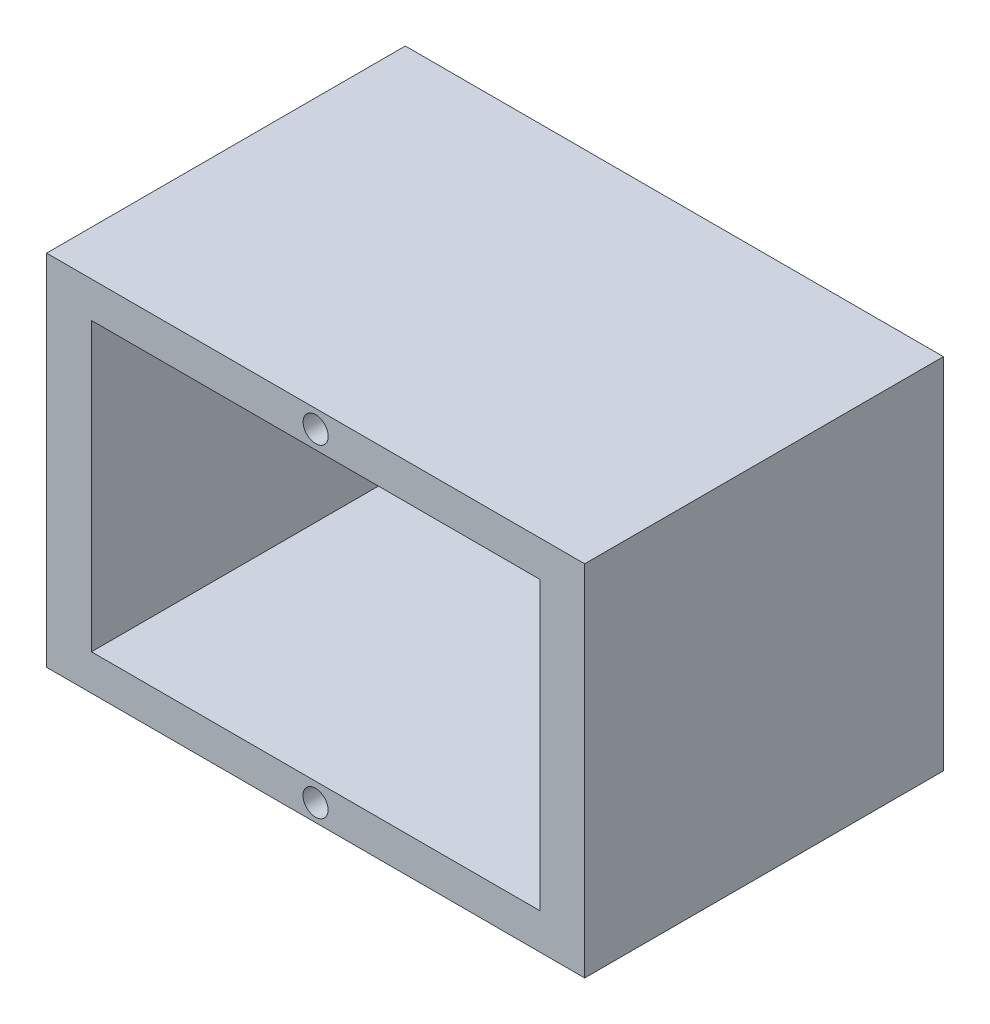
ISO-10303-21;
HEADER;
FILE_DESCRIPTION(('STEP AP214'),'2;1');
FILE_NAME('part.step','',(''),(''),'','','');
FILE_SCHEMA(('AUTOMOTIVE_DESIGN { 1 0 10303 214 1 1 1 1 }'));
ENDSEC;
DATA;
#1=APPLICATION_CONTEXT('core data for automotive mechanical design processes');
#2=APPLICATION_PROTOCOL_DEFINITION('international standard','automotive_design',2000,#1);
#3=PRODUCT_CONTEXT('',#1,'mechanical');
#4=PRODUCT('Part','Part','',(#3));
#5=PRODUCT_RELATED_PRODUCT_CATEGORY('part','',(#4));
#6=PRODUCT_DEFINITION_FORMATION('','',#4);
#7=PRODUCT_DEFINITION_CONTEXT('part definition',#1,'design');
#8=PRODUCT_DEFINITION('design','',#6,#7);
#9=PRODUCT_DEFINITION_SHAPE('','',#8);
#10=(LENGTH_UNIT() NAMED_UNIT(*) SI_UNIT(.MILLI.,.METRE.));
#11=(NAMED_UNIT(*) PLANE_ANGLE_UNIT() SI_UNIT($,.RADIAN.));
#12=(NAMED_UNIT(*) SI_UNIT($,.STERADIAN.) SOLID_ANGLE_UNIT());
#13=UNCERTAINTY_MEASURE_WITH_UNIT(LENGTH_MEASURE(1.E-05),#10,'distance_accuracy_value','');
#14=(GEOMETRIC_REPRESENTATION_CONTEXT(3) GLOBAL_UNCERTAINTY_ASSIGNED_CONTEXT((#13)) GLOBAL_UNIT_ASSIGNED_CONTEXT((#10,
#11,#12)) REPRESENTATION_CONTEXT('',''));
#15=CARTESIAN_POINT('',(0.,0.,0.));
#16=DIRECTION('',(0.,0.,1.));
#17=DIRECTION('',(1.,0.,0.));
#18=AXIS2_PLACEMENT_3D('',#15,#16,#17);
#19=CARTESIAN_POINT('',(0.,0.,50.8));
#20=DIRECTION('',(0.,0.,1.));
#21=DIRECTION('',(1.,0.,0.));
#22=AXIS2_PLACEMENT_3D('',#19,#20,#21);
#23=PLANE('',#22);
#24=CARTESIAN_POINT('',(30.6278434783437,-39.0114991140654,50.8));
#25=DIRECTION('',(0.,0.,1.));
#26=DIRECTION('',(1.,0.,0.));
#27=AXIS2_PLACEMENT_3D('',#24,#25,#26);
#28=CIRCLE('',#27,1.778);
#29=CARTESIAN_POINT('',(32.4058434783437,-39.0114991140654,50.8));
#30=VERTEX_POINT('',#29);
#31=EDGE_CURVE('E484',#30,#30,#28,.T.);
#32=ORIENTED_EDGE('',*,*,#31,.F.);
#33=EDGE_LOOP('',(#32));
#34=FACE_BOUND('',#33,.T.);
#35=CARTESIAN_POINT('',(30.6467259644347,6.81008253647398,50.8));
#36=DIRECTION('',(0.,0.,1.));
#37=DIRECTION('',(1.,0.,0.));
#38=AXIS2_PLACEMENT_3D('',#35,#36,#37);
#39=CIRCLE('',#38,1.778);
#40=CARTESIAN_POINT('',(32.4247259644347,6.81008253647398,50.8));
#41=VERTEX_POINT('',#40);
#42=EDGE_CURVE('E482',#41,#41,#39,.T.);
#43=ORIENTED_EDGE('',*,*,#42,.F.);
#44=EDGE_LOOP('',(#43));
#45=FACE_BOUND('',#44,.T.);
#46=DIRECTION('',(0.,-1.,0.));
#47=VECTOR('',#46,1.);
#48=CARTESIAN_POINT('',(-7.4532740355653,9.35008253647398,50.8));
#49=LINE('',#48,#47);
#50=CARTESIAN_POINT('',(-7.4532740355653,9.35008253647398,50.8));
#51=VERTEX_POINT('',#50);
#52=CARTESIAN_POINT('',(-7.45327403556529,-41.449917463526,50.8));
#53=VERTEX_POINT('',#52);
#54=EDGE_CURVE('E305',#51,#53,#49,.T.);
#55=ORIENTED_EDGE('',*,*,#54,.T.);
#56=DIRECTION('',(1.,0.,0.));
#57=VECTOR('',#56,1.);
#58=CARTESIAN_POINT('',(-7.45327403556529,-41.449917463526,50.8));
#59=LINE('',#58,#57);
#60=CARTESIAN_POINT('',(68.7467259644347,-41.449917463526,50.8));
#61=VERTEX_POINT('',#60);
#62=EDGE_CURVE('E228',#53,#61,#59,.T.);
#63=ORIENTED_EDGE('',*,*,#62,.T.);
#64=DIRECTION('',(0.,-1.,0.));
#65=VECTOR('',#64,1.);
#66=CARTESIAN_POINT('',(68.7467259644347,9.35008253647398,50.8));
#67=LINE('',#66,#65);
#68=CARTESIAN_POINT('',(68.7467259644347,9.35008253647398,50.8));
#69=VERTEX_POINT('',#68);
#70=EDGE_CURVE('E308',#69,#61,#67,.T.);
#71=ORIENTED_EDGE('',*,*,#70,.F.);
#72=DIRECTION('',(1.,0.,0.));
#73=VECTOR('',#72,1.);
#74=CARTESIAN_POINT('',(-7.4532740355653,9.35008253647398,50.8));
#75=LINE('',#74,#73);
#76=EDGE_CURVE('E315',#51,#69,#75,.T.);
#77=ORIENTED_EDGE('',*,*,#76,.F.);
#78=EDGE_LOOP('',(#55,#63,#71,#77));
#79=FACE_BOUND('',#78,.T.);
#80=DIRECTION('',(1.,0.,0.));
#81=VECTOR('',#80,1.);
#82=CARTESIAN_POINT('',(0.,-36.369917463526,50.8));
#83=LINE('',#82,#81);
#84=CARTESIAN_POINT('',(-1.1032740355653,-36.369917463526,50.8));
#85=VERTEX_POINT('',#84);
#86=CARTESIAN_POINT('',(62.3967259644347,-36.369917463526,50.8));
#87=VERTEX_POINT('',#86);
#88=EDGE_CURVE('E285',#85,#87,#83,.T.);
#89=ORIENTED_EDGE('',*,*,#88,.F.);
#90=DIRECTION('',(0.,1.,0.));
#91=VECTOR('',#90,1.);
#92=CARTESIAN_POINT('',(-1.1032740355653,0.,50.8));
#93=LINE('',#92,#91);
#94=CARTESIAN_POINT('',(-1.1032740355653,4.27008253647398,50.8));
#95=VERTEX_POINT('',#94);
#96=EDGE_CURVE('E192',#85,#95,#93,.T.);
#97=ORIENTED_EDGE('',*,*,#96,.T.);
#98=DIRECTION('',(1.,0.,0.));
#99=VECTOR('',#98,1.);
#100=CARTESIAN_POINT('',(0.,4.27008253647398,50.8));
#101=LINE('',#100,#99);
#102=CARTESIAN_POINT('',(62.3967259644347,4.27008253647398,50.8));
#103=VERTEX_POINT('',#102);
#104=EDGE_CURVE('E267',#95,#103,#101,.T.);
#105=ORIENTED_EDGE('',*,*,#104,.T.);
#106=DIRECTION('',(0.,1.,0.));
#107=VECTOR('',#106,1.);
#108=CARTESIAN_POINT('',(62.3967259644347,0.,50.8));
#109=LINE('',#108,#107);
#110=EDGE_CURVE('E286',#87,#103,#109,.T.);
#111=ORIENTED_EDGE('',*,*,#110,.F.);
#112=EDGE_LOOP('',(#89,#97,#105,#111));
#113=FACE_BOUND('',#112,.T.);
#114=ADVANCED_FACE('F174',(#34,#45,#79,#113),#23,.T.);
#115=CARTESIAN_POINT('',(-7.4532740355653,9.35008253647398,50.8));
#116=DIRECTION('',(1.,0.,0.));
#117=DIRECTION('',(0.,1.,0.));
#118=AXIS2_PLACEMENT_3D('',#115,#116,#117);
#119=PLANE('',#118);
#120=DIRECTION('',(0.,-1.,0.));
#121=VECTOR('',#120,1.);
#122=CARTESIAN_POINT('',(-7.4532740355653,9.35008253647398,0.));
#123=LINE('',#122,#121);
#124=CARTESIAN_POINT('',(-7.4532740355653,9.35008253647398,0.));
#125=VERTEX_POINT('',#124);
#126=CARTESIAN_POINT('',(-7.45327403556529,-41.449917463526,0.));
#127=VERTEX_POINT('',#126);
#128=EDGE_CURVE('E298',#125,#127,#123,.T.);
#129=ORIENTED_EDGE('',*,*,#128,.T.);
#130=DIRECTION('',(0.,0.,-1.));
#131=VECTOR('',#130,1.);
#132=CARTESIAN_POINT('',(-7.45327403556529,-41.449917463526,50.8));
#133=LINE('',#132,#131);
#134=EDGE_CURVE('E12',#53,#127,#133,.T.);
#135=ORIENTED_EDGE('',*,*,#134,.F.);
#136=ORIENTED_EDGE('',*,*,#54,.F.);
#137=DIRECTION('',(0.,0.,-1.));
#138=VECTOR('',#137,1.);
#139=CARTESIAN_POINT('',(-7.4532740355653,9.35008253647398,50.8));
#140=LINE('',#139,#138);
#141=EDGE_CURVE('E196',#51,#125,#140,.T.);
#142=ORIENTED_EDGE('',*,*,#141,.T.);
#143=EDGE_LOOP('',(#129,#135,#136,#142));
#144=FACE_BOUND('',#143,.T.);
#145=ADVANCED_FACE('F180',(#144),#119,.F.);
#146=CARTESIAN_POINT('',(-7.45327403556529,-41.449917463526,50.8));
#147=DIRECTION('',(0.,1.,0.));
#148=DIRECTION('',(0.,0.,1.));
#149=AXIS2_PLACEMENT_3D('',#146,#147,#148);
#150=PLANE('',#149);
#151=DIRECTION('',(1.,0.,0.));
#152=VECTOR('',#151,1.);
#153=CARTESIAN_POINT('',(-7.45327403556529,-41.449917463526,0.));
#154=LINE('',#153,#152);
#155=CARTESIAN_POINT('',(68.7467259644347,-41.449917463526,0.));
#156=VERTEX_POINT('',#155);
#157=EDGE_CURVE('E320',#127,#156,#154,.T.);
#158=ORIENTED_EDGE('',*,*,#157,.T.);
#159=DIRECTION('',(0.,0.,-1.));
#160=VECTOR('',#159,1.);
#161=CARTESIAN_POINT('',(68.7467259644347,-41.449917463526,50.8));
#162=LINE('',#161,#160);
#163=EDGE_CURVE('E183',#61,#156,#162,.T.);
#164=ORIENTED_EDGE('',*,*,#163,.F.);
#165=ORIENTED_EDGE('',*,*,#62,.F.);
#166=ORIENTED_EDGE('',*,*,#134,.T.);
#167=EDGE_LOOP('',(#158,#164,#165,#166));
#168=FACE_BOUND('',#167,.T.);
#169=ADVANCED_FACE('F340',(#168),#150,.F.);
#170=CARTESIAN_POINT('',(68.7467259644347,9.35008253647398,50.8));
#171=DIRECTION('',(1.,0.,0.));
#172=DIRECTION('',(0.,0.,-1.));
#173=AXIS2_PLACEMENT_3D('',#170,#171,#172);
#174=PLANE('',#173);
#175=DIRECTION('',(0.,-1.,0.));
#176=VECTOR('',#175,1.);
#177=CARTESIAN_POINT('',(68.7467259644347,9.35008253647398,0.));
#178=LINE('',#177,#176);
#179=CARTESIAN_POINT('',(68.7467259644347,9.35008253647398,0.));
#180=VERTEX_POINT('',#179);
#181=EDGE_CURVE('E322',#180,#156,#178,.T.);
#182=ORIENTED_EDGE('',*,*,#181,.F.);
#183=DIRECTION('',(0.,0.,-1.));
#184=VECTOR('',#183,1.);
#185=CARTESIAN_POINT('',(68.7467259644347,9.35008253647398,50.8));
#186=LINE('',#185,#184);
#187=EDGE_CURVE('E326',#69,#180,#186,.T.);
#188=ORIENTED_EDGE('',*,*,#187,.F.);
#189=ORIENTED_EDGE('',*,*,#70,.T.);
#190=ORIENTED_EDGE('',*,*,#163,.T.);
#191=EDGE_LOOP('',(#182,#188,#189,#190));
#192=FACE_BOUND('',#191,.T.);
#193=ADVANCED_FACE('F335',(#192),#174,.T.);
#194=CARTESIAN_POINT('',(-7.4532740355653,9.35008253647398,50.8));
#195=DIRECTION('',(0.,1.,0.));
#196=DIRECTION('',(0.,0.,1.));
#197=AXIS2_PLACEMENT_3D('',#194,#195,#196);
#198=PLANE('',#197);
#199=DIRECTION('',(1.,0.,0.));
#200=VECTOR('',#199,1.);
#201=CARTESIAN_POINT('',(-7.4532740355653,9.35008253647398,0.));
#202=LINE('',#201,#200);
#203=EDGE_CURVE('E304',#125,#180,#202,.T.);
#204=ORIENTED_EDGE('',*,*,#203,.F.);
#205=ORIENTED_EDGE('',*,*,#141,.F.);
#206=ORIENTED_EDGE('',*,*,#76,.T.);
#207=ORIENTED_EDGE('',*,*,#187,.T.);
#208=EDGE_LOOP('',(#204,#205,#206,#207));
#209=FACE_BOUND('',#208,.T.);
#210=ADVANCED_FACE('F342',(#209),#198,.T.);
#211=CARTESIAN_POINT('',(0.,0.,0.));
#212=DIRECTION('',(0.,0.,1.));
#213=DIRECTION('',(1.,0.,0.));
#214=AXIS2_PLACEMENT_3D('',#211,#212,#213);
#215=PLANE('',#214);
#216=CARTESIAN_POINT('',(15.5662585615327,-14.584417496473,0.));
#217=DIRECTION('',(0.,0.,1.));
#218=DIRECTION('',(1.,0.,0.));
#219=AXIS2_PLACEMENT_3D('',#216,#217,#218);
#220=CIRCLE('',#219,1.5875);
#221=CARTESIAN_POINT('',(17.1537585615327,-14.584417496473,0.));
#222=VERTEX_POINT('',#221);
#223=EDGE_CURVE('E283',#222,#222,#220,.T.);
#224=ORIENTED_EDGE('',*,*,#223,.T.);
#225=EDGE_LOOP('',(#224));
#226=FACE_BOUND('',#225,.T.);
#227=CARTESIAN_POINT('',(32.0762585615327,-14.584417496473,0.));
#228=DIRECTION('',(0.,0.,1.));
#229=DIRECTION('',(1.,0.,0.));
#230=AXIS2_PLACEMENT_3D('',#227,#228,#229);
#231=CIRCLE('',#230,3.17500000000001);
#232=CARTESIAN_POINT('',(35.2512585615327,-14.584417496473,0.));
#233=VERTEX_POINT('',#232);
#234=EDGE_CURVE('E492',#233,#233,#231,.T.);
#235=ORIENTED_EDGE('',*,*,#234,.T.);
#236=EDGE_LOOP('',(#235));
#237=FACE_BOUND('',#236,.T.);
#238=ORIENTED_EDGE('',*,*,#128,.F.);
#239=ORIENTED_EDGE('',*,*,#203,.T.);
#240=ORIENTED_EDGE('',*,*,#181,.T.);
#241=ORIENTED_EDGE('',*,*,#157,.F.);
#242=EDGE_LOOP('',(#238,#239,#240,#241));
#243=FACE_BOUND('',#242,.T.);
#244=ADVANCED_FACE('F338',(#226,#237,#243),#215,.F.);
#245=CARTESIAN_POINT('',(-1.1032740355653,0.,10.16));
#246=DIRECTION('',(1.,0.,0.));
#247=DIRECTION('',(0.,0.,-1.));
#248=AXIS2_PLACEMENT_3D('',#245,#246,#247);
#249=PLANE('',#248);
#250=ORIENTED_EDGE('',*,*,#96,.F.);
#251=DIRECTION('',(0.,0.,1.));
#252=VECTOR('',#251,1.);
#253=CARTESIAN_POINT('',(-1.1032740355653,-36.369917463526,10.16));
#254=LINE('',#253,#252);
#255=CARTESIAN_POINT('',(-1.1032740355653,-36.369917463526,10.16));
#256=VERTEX_POINT('',#255);
#257=EDGE_CURVE('E247',#256,#85,#254,.T.);
#258=ORIENTED_EDGE('',*,*,#257,.F.);
#259=DIRECTION('',(0.,1.,0.));
#260=VECTOR('',#259,1.);
#261=CARTESIAN_POINT('',(-1.1032740355653,0.,10.16));
#262=LINE('',#261,#260);
#263=CARTESIAN_POINT('',(-1.1032740355653,4.27008253647398,10.16));
#264=VERTEX_POINT('',#263);
#265=EDGE_CURVE('E252',#256,#264,#262,.T.);
#266=ORIENTED_EDGE('',*,*,#265,.T.);
#267=DIRECTION('',(0.,0.,1.));
#268=VECTOR('',#267,1.);
#269=CARTESIAN_POINT('',(-1.1032740355653,4.27008253647398,10.16));
#270=LINE('',#269,#268);
#271=EDGE_CURVE('E291',#264,#95,#270,.T.);
#272=ORIENTED_EDGE('',*,*,#271,.T.);
#273=EDGE_LOOP('',(#250,#258,#266,#272));
#274=FACE_BOUND('',#273,.T.);
#275=ADVANCED_FACE('F249',(#274),#249,.T.);
#276=CARTESIAN_POINT('',(0.,4.27008253647398,10.16));
#277=DIRECTION('',(0.,-1.,0.));
#278=DIRECTION('',(0.,0.,-1.));
#279=AXIS2_PLACEMENT_3D('',#276,#277,#278);
#280=PLANE('',#279);
#281=ORIENTED_EDGE('',*,*,#104,.F.);
#282=ORIENTED_EDGE('',*,*,#271,.F.);
#283=DIRECTION('',(1.,0.,0.));
#284=VECTOR('',#283,1.);
#285=CARTESIAN_POINT('',(0.,4.27008253647398,10.16));
#286=LINE('',#285,#284);
#287=CARTESIAN_POINT('',(62.3967259644347,4.27008253647398,10.16));
#288=VERTEX_POINT('',#287);
#289=EDGE_CURVE('E256',#264,#288,#286,.T.);
#290=ORIENTED_EDGE('',*,*,#289,.T.);
#291=DIRECTION('',(0.,0.,1.));
#292=VECTOR('',#291,1.);
#293=CARTESIAN_POINT('',(62.3967259644347,4.27008253647398,10.16));
#294=LINE('',#293,#292);
#295=EDGE_CURVE('E300',#288,#103,#294,.T.);
#296=ORIENTED_EDGE('',*,*,#295,.T.);
#297=EDGE_LOOP('',(#281,#282,#290,#296));
#298=FACE_BOUND('',#297,.T.);
#299=ADVANCED_FACE('F381',(#298),#280,.T.);
#300=CARTESIAN_POINT('',(62.3967259644347,0.,10.16));
#301=DIRECTION('',(1.,0.,0.));
#302=DIRECTION('',(0.,0.,-1.));
#303=AXIS2_PLACEMENT_3D('',#300,#301,#302);
#304=PLANE('',#303);
#305=ORIENTED_EDGE('',*,*,#110,.T.);
#306=ORIENTED_EDGE('',*,*,#295,.F.);
#307=DIRECTION('',(0.,1.,0.));
#308=VECTOR('',#307,1.);
#309=CARTESIAN_POINT('',(62.3967259644347,0.,10.16));
#310=LINE('',#309,#308);
#311=CARTESIAN_POINT('',(62.3967259644347,-36.369917463526,10.16));
#312=VERTEX_POINT('',#311);
#313=EDGE_CURVE('E275',#312,#288,#310,.T.);
#314=ORIENTED_EDGE('',*,*,#313,.F.);
#315=DIRECTION('',(0.,0.,1.));
#316=VECTOR('',#315,1.);
#317=CARTESIAN_POINT('',(62.3967259644347,-36.369917463526,10.16));
#318=LINE('',#317,#316);
#319=EDGE_CURVE('E259',#312,#87,#318,.T.);
#320=ORIENTED_EDGE('',*,*,#319,.T.);
#321=EDGE_LOOP('',(#305,#306,#314,#320));
#322=FACE_BOUND('',#321,.T.);
#323=ADVANCED_FACE('F395',(#322),#304,.F.);
#324=CARTESIAN_POINT('',(0.,-36.369917463526,10.16));
#325=DIRECTION('',(0.,-1.,0.));
#326=DIRECTION('',(0.,0.,-1.));
#327=AXIS2_PLACEMENT_3D('',#324,#325,#326);
#328=PLANE('',#327);
#329=ORIENTED_EDGE('',*,*,#88,.T.);
#330=ORIENTED_EDGE('',*,*,#319,.F.);
#331=DIRECTION('',(1.,0.,0.));
#332=VECTOR('',#331,1.);
#333=CARTESIAN_POINT('',(0.,-36.369917463526,10.16));
#334=LINE('',#333,#332);
#335=EDGE_CURVE('E261',#256,#312,#334,.T.);
#336=ORIENTED_EDGE('',*,*,#335,.F.);
#337=ORIENTED_EDGE('',*,*,#257,.T.);
#338=EDGE_LOOP('',(#329,#330,#336,#337));
#339=FACE_BOUND('',#338,.T.);
#340=ADVANCED_FACE('F268',(#339),#328,.F.);
#341=CARTESIAN_POINT('',(0.,0.,10.16));
#342=DIRECTION('',(0.,0.,1.));
#343=DIRECTION('',(1.,0.,0.));
#344=AXIS2_PLACEMENT_3D('',#341,#342,#343);
#345=PLANE('',#344);
#346=CARTESIAN_POINT('',(15.5662585615327,-14.584417496473,10.16));
#347=DIRECTION('',(0.,0.,1.));
#348=DIRECTION('',(1.,0.,0.));
#349=AXIS2_PLACEMENT_3D('',#346,#347,#348);
#350=CIRCLE('',#349,1.5875);
#351=CARTESIAN_POINT('',(17.1537585615327,-14.584417496473,10.16));
#352=VERTEX_POINT('',#351);
#353=EDGE_CURVE('E499',#352,#352,#350,.T.);
#354=ORIENTED_EDGE('',*,*,#353,.F.);
#355=EDGE_LOOP('',(#354));
#356=FACE_BOUND('',#355,.T.);
#357=CARTESIAN_POINT('',(32.0762585615327,-14.584417496473,10.16));
#358=DIRECTION('',(0.,0.,1.));
#359=DIRECTION('',(1.,0.,0.));
#360=AXIS2_PLACEMENT_3D('',#357,#358,#359);
#361=CIRCLE('',#360,3.17500000000001);
#362=CARTESIAN_POINT('',(35.2512585615327,-14.584417496473,10.16));
#363=VERTEX_POINT('',#362);
#364=EDGE_CURVE('E502',#363,#363,#361,.T.);
#365=ORIENTED_EDGE('',*,*,#364,.F.);
#366=EDGE_LOOP('',(#365));
#367=FACE_BOUND('',#366,.T.);
#368=ORIENTED_EDGE('',*,*,#265,.F.);
#369=ORIENTED_EDGE('',*,*,#335,.T.);
#370=ORIENTED_EDGE('',*,*,#313,.T.);
#371=ORIENTED_EDGE('',*,*,#289,.F.);
#372=EDGE_LOOP('',(#368,#369,#370,#371));
#373=FACE_BOUND('',#372,.T.);
#374=ADVANCED_FACE('F263',(#356,#367,#373),#345,.T.);
#375=CARTESIAN_POINT('',(32.0762585615327,-14.584417496473,0.));
#376=DIRECTION('',(0.,0.,1.));
#377=DIRECTION('',(1.,0.,0.));
#378=AXIS2_PLACEMENT_3D('',#375,#376,#377);
#379=CYLINDRICAL_SURFACE('',#378,3.17500000000001);
#380=ORIENTED_EDGE('',*,*,#234,.F.);
#381=EDGE_LOOP('',(#380));
#382=FACE_BOUND('',#381,.T.);
#383=ORIENTED_EDGE('',*,*,#364,.T.);
#384=EDGE_LOOP('',(#383));
#385=FACE_BOUND('',#384,.T.);
#386=ADVANCED_FACE('F420',(#382,#385),#379,.F.);
#387=CARTESIAN_POINT('',(15.5662585615327,-14.584417496473,0.));
#388=DIRECTION('',(0.,0.,1.));
#389=DIRECTION('',(1.,0.,0.));
#390=AXIS2_PLACEMENT_3D('',#387,#388,#389);
#391=CYLINDRICAL_SURFACE('',#390,1.5875);
#392=ORIENTED_EDGE('',*,*,#223,.F.);
#393=EDGE_LOOP('',(#392));
#394=FACE_BOUND('',#393,.T.);
#395=ORIENTED_EDGE('',*,*,#353,.T.);
#396=EDGE_LOOP('',(#395));
#397=FACE_BOUND('',#396,.T.);
#398=ADVANCED_FACE('F426',(#394,#397),#391,.F.);
#399=CARTESIAN_POINT('',(30.6467259644347,6.81008253647398,38.1));
#400=DIRECTION('',(0.,0.,1.));
#401=DIRECTION('',(1.,0.,0.));
#402=AXIS2_PLACEMENT_3D('',#399,#400,#401);
#403=CYLINDRICAL_SURFACE('',#402,1.778);
#404=CARTESIAN_POINT('',(30.6467259644347,6.81008253647398,38.1));
#405=DIRECTION('',(0.,0.,1.));
#406=DIRECTION('',(1.,0.,0.));
#407=AXIS2_PLACEMENT_3D('',#404,#405,#406);
#408=CIRCLE('',#407,1.778);
#409=CARTESIAN_POINT('',(32.4247259644347,6.81008253647398,38.1));
#410=VERTEX_POINT('',#409);
#411=EDGE_CURVE('E486',#410,#410,#408,.T.);
#412=ORIENTED_EDGE('',*,*,#411,.F.);
#413=EDGE_LOOP('',(#412));
#414=FACE_BOUND('',#413,.T.);
#415=ORIENTED_EDGE('',*,*,#42,.T.);
#416=EDGE_LOOP('',(#415));
#417=FACE_BOUND('',#416,.T.);
#418=ADVANCED_FACE('F440',(#414,#417),#403,.F.);
#419=CARTESIAN_POINT('',(30.6467259644347,6.81008253647398,38.1));
#420=DIRECTION('',(0.,0.,1.));
#421=DIRECTION('',(1.,0.,0.));
#422=AXIS2_PLACEMENT_3D('',#419,#420,#421);
#423=PLANE('',#422);
#424=ORIENTED_EDGE('',*,*,#411,.T.);
#425=EDGE_LOOP('',(#424));
#426=FACE_BOUND('',#425,.T.);
#427=ADVANCED_FACE('F444',(#426),#423,.T.);
#428=CARTESIAN_POINT('',(30.6278434783437,-39.0114991140654,38.1));
#429=DIRECTION('',(0.,0.,1.));
#430=DIRECTION('',(1.,0.,0.));
#431=AXIS2_PLACEMENT_3D('',#428,#429,#430);
#432=CYLINDRICAL_SURFACE('',#431,1.778);
#433=CARTESIAN_POINT('',(30.6278434783437,-39.0114991140654,38.1));
#434=DIRECTION('',(0.,0.,1.));
#435=DIRECTION('',(1.,0.,0.));
#436=AXIS2_PLACEMENT_3D('',#433,#434,#435);
#437=CIRCLE('',#436,1.778);
#438=CARTESIAN_POINT('',(32.4058434783437,-39.0114991140654,38.1));
#439=VERTEX_POINT('',#438);
#440=EDGE_CURVE('E476',#439,#439,#437,.T.);
#441=ORIENTED_EDGE('',*,*,#440,.F.);
#442=EDGE_LOOP('',(#441));
#443=FACE_BOUND('',#442,.T.);
#444=ORIENTED_EDGE('',*,*,#31,.T.);
#445=EDGE_LOOP('',(#444));
#446=FACE_BOUND('',#445,.T.);
#447=ADVANCED_FACE('F454',(#443,#446),#432,.F.);
#448=CARTESIAN_POINT('',(30.6278434783437,-39.0114991140654,38.1));
#449=DIRECTION('',(0.,0.,1.));
#450=DIRECTION('',(1.,0.,0.));
#451=AXIS2_PLACEMENT_3D('',#448,#449,#450);
#452=PLANE('',#451);
#453=ORIENTED_EDGE('',*,*,#440,.T.);
#454=EDGE_LOOP('',(#453));
#455=FACE_BOUND('',#454,.T.);
#456=ADVANCED_FACE('F465',(#455),#452,.T.);
#457=CLOSED_SHELL('',(#114,#145,#169,#193,#210,#244,#275,#299,#323,#340,#374,#386,#398,#418,
#427,#447,#456));
#458=MANIFOLD_SOLID_BREP('B2',#457);
#459=ADVANCED_BREP_SHAPE_REPRESENTATION('',(#18,#458),#14);
#460=SHAPE_DEFINITION_REPRESENTATION(#9,#459);
ENDSEC;
END-ISO-10303-21;
